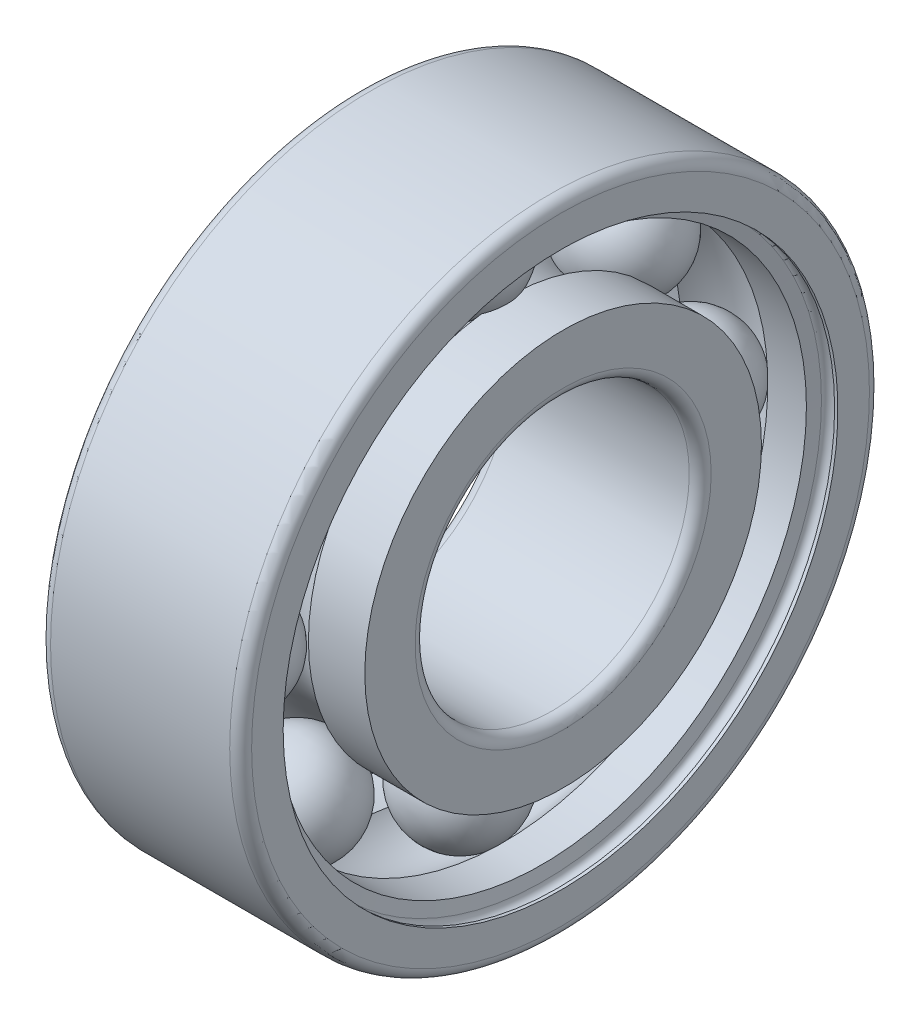
ISO-10303-21;
HEADER;
FILE_DESCRIPTION(('STEP AP214'),'2;1');
FILE_NAME('part.step','',(''),(''),'','','');
FILE_SCHEMA(('AUTOMOTIVE_DESIGN { 1 0 10303 214 1 1 1 1 }'));
ENDSEC;
DATA;
#1=APPLICATION_CONTEXT('core data for automotive mechanical design processes');
#2=APPLICATION_PROTOCOL_DEFINITION('international standard','automotive_design',2000,#1);
#3=PRODUCT_CONTEXT('',#1,'mechanical');
#4=PRODUCT('Part','Part','',(#3));
#5=PRODUCT_RELATED_PRODUCT_CATEGORY('part','',(#4));
#6=PRODUCT_DEFINITION_FORMATION('','',#4);
#7=PRODUCT_DEFINITION_CONTEXT('part definition',#1,'design');
#8=PRODUCT_DEFINITION('design','',#6,#7);
#9=PRODUCT_DEFINITION_SHAPE('','',#8);
#10=(LENGTH_UNIT() NAMED_UNIT(*) SI_UNIT(.MILLI.,.METRE.));
#11=(NAMED_UNIT(*) PLANE_ANGLE_UNIT() SI_UNIT($,.RADIAN.));
#12=(NAMED_UNIT(*) SI_UNIT($,.STERADIAN.) SOLID_ANGLE_UNIT());
#13=UNCERTAINTY_MEASURE_WITH_UNIT(LENGTH_MEASURE(1.E-05),#10,'distance_accuracy_value','');
#14=(GEOMETRIC_REPRESENTATION_CONTEXT(3) GLOBAL_UNCERTAINTY_ASSIGNED_CONTEXT((#13)) GLOBAL_UNIT_ASSIGNED_CONTEXT((#10,
#11,#12)) REPRESENTATION_CONTEXT('',''));
#15=CARTESIAN_POINT('',(0.,0.,0.));
#16=DIRECTION('',(0.,0.,1.));
#17=DIRECTION('',(1.,0.,0.));
#18=AXIS2_PLACEMENT_3D('',#15,#16,#17);
#19=CARTESIAN_POINT('',(5.5,0.,12.63));
#20=DIRECTION('',(0.,0.,-1.));
#21=DIRECTION('',(0.,1.,0.));
#22=AXIS2_PLACEMENT_3D('',#19,#20,#21);
#23=SPHERICAL_SURFACE('',#22,3.);
#24=CARTESIAN_POINT('',(5.5,0.,15.63));
#25=VERTEX_POINT('',#24);
#26=VERTEX_LOOP('',#25);
#27=FACE_BOUND('',#26,.T.);
#28=CARTESIAN_POINT('',(5.5,0.,9.63));
#29=VERTEX_POINT('',#28);
#30=VERTEX_LOOP('',#29);
#31=FACE_BOUND('',#30,.T.);
#32=ADVANCED_FACE('P0_F16',(#27,#31),#23,.T.);
#33=CLOSED_SHELL('',(#32));
#34=MANIFOLD_SOLID_BREP('P0_B1',#33);
#35=CARTESIAN_POINT('',(5.5,-8.93075864638609,-8.9307586463861));
#36=DIRECTION('',(0.,0.707106781186547,0.707106781186548));
#37=DIRECTION('',(0.,-0.707106781186548,0.707106781186547));
#38=AXIS2_PLACEMENT_3D('',#35,#36,#37);
#39=SPHERICAL_SURFACE('',#38,3.);
#40=CARTESIAN_POINT('',(5.5,-11.0520789899457,-11.0520789899457));
#41=VERTEX_POINT('',#40);
#42=VERTEX_LOOP('',#41);
#43=FACE_BOUND('',#42,.T.);
#44=CARTESIAN_POINT('',(5.5,-6.80943830282645,-6.80943830282646));
#45=VERTEX_POINT('',#44);
#46=VERTEX_LOOP('',#45);
#47=FACE_BOUND('',#46,.T.);
#48=ADVANCED_FACE('P1_F16',(#43,#47),#39,.T.);
#49=CLOSED_SHELL('',(#48));
#50=MANIFOLD_SOLID_BREP('P1_B1',#49);
#51=CARTESIAN_POINT('',(5.5,8.93075864638609,8.9307586463861));
#52=DIRECTION('',(0.,-0.707106781186547,-0.707106781186548));
#53=DIRECTION('',(0.,0.707106781186548,-0.707106781186547));
#54=AXIS2_PLACEMENT_3D('',#51,#52,#53);
#55=SPHERICAL_SURFACE('',#54,3.);
#56=CARTESIAN_POINT('',(5.5,11.0520789899457,11.0520789899457));
#57=VERTEX_POINT('',#56);
#58=VERTEX_LOOP('',#57);
#59=FACE_BOUND('',#58,.T.);
#60=CARTESIAN_POINT('',(5.5,6.80943830282645,6.80943830282646));
#61=VERTEX_POINT('',#60);
#62=VERTEX_LOOP('',#61);
#63=FACE_BOUND('',#62,.T.);
#64=ADVANCED_FACE('P2_F15',(#59,#63),#55,.T.);
#65=CLOSED_SHELL('',(#64));
#66=MANIFOLD_SOLID_BREP('P2_B1',#65);
#67=CARTESIAN_POINT('',(5.5,-8.9307586463861,8.93075864638609));
#68=DIRECTION('',(0.,0.707106781186548,-0.707106781186547));
#69=DIRECTION('',(0.,0.707106781186547,0.707106781186548));
#70=AXIS2_PLACEMENT_3D('',#67,#68,#69);
#71=SPHERICAL_SURFACE('',#70,3.);
#72=CARTESIAN_POINT('',(5.5,-11.0520789899457,11.0520789899457));
#73=VERTEX_POINT('',#72);
#74=VERTEX_LOOP('',#73);
#75=FACE_BOUND('',#74,.T.);
#76=CARTESIAN_POINT('',(5.5,-6.80943830282646,6.80943830282645));
#77=VERTEX_POINT('',#76);
#78=VERTEX_LOOP('',#77);
#79=FACE_BOUND('',#78,.T.);
#80=ADVANCED_FACE('P3_F16',(#75,#79),#71,.T.);
#81=CLOSED_SHELL('',(#80));
#82=MANIFOLD_SOLID_BREP('P3_B1',#81);
#83=CARTESIAN_POINT('',(5.5,8.9307586463861,-8.93075864638609));
#84=DIRECTION('',(0.,-0.707106781186548,0.707106781186547));
#85=DIRECTION('',(0.,-0.707106781186547,-0.707106781186548));
#86=AXIS2_PLACEMENT_3D('',#83,#84,#85);
#87=SPHERICAL_SURFACE('',#86,3.);
#88=CARTESIAN_POINT('',(5.5,11.0520789899457,-11.0520789899457));
#89=VERTEX_POINT('',#88);
#90=VERTEX_LOOP('',#89);
#91=FACE_BOUND('',#90,.T.);
#92=CARTESIAN_POINT('',(5.5,6.80943830282646,-6.80943830282645));
#93=VERTEX_POINT('',#92);
#94=VERTEX_LOOP('',#93);
#95=FACE_BOUND('',#94,.T.);
#96=ADVANCED_FACE('P4_F16',(#91,#95),#87,.T.);
#97=CLOSED_SHELL('',(#96));
#98=MANIFOLD_SOLID_BREP('P4_B1',#97);
#99=CARTESIAN_POINT('',(5.5,0.,-12.63));
#100=DIRECTION('',(0.,0.,1.));
#101=DIRECTION('',(0.,-1.,0.));
#102=AXIS2_PLACEMENT_3D('',#99,#100,#101);
#103=SPHERICAL_SURFACE('',#102,3.);
#104=CARTESIAN_POINT('',(5.5,0.,-15.63));
#105=VERTEX_POINT('',#104);
#106=VERTEX_LOOP('',#105);
#107=FACE_BOUND('',#106,.T.);
#108=CARTESIAN_POINT('',(5.5,0.,-9.63));
#109=VERTEX_POINT('',#108);
#110=VERTEX_LOOP('',#109);
#111=FACE_BOUND('',#110,.T.);
#112=ADVANCED_FACE('P5_F16',(#107,#111),#103,.T.);
#113=CLOSED_SHELL('',(#112));
#114=MANIFOLD_SOLID_BREP('P5_B1',#113);
#115=CARTESIAN_POINT('',(5.5,-12.63,0.));
#116=DIRECTION('',(0.,1.,0.));
#117=DIRECTION('',(0.,0.,1.));
#118=AXIS2_PLACEMENT_3D('',#115,#116,#117);
#119=SPHERICAL_SURFACE('',#118,3.);
#120=CARTESIAN_POINT('',(5.5,-15.63,0.));
#121=VERTEX_POINT('',#120);
#122=VERTEX_LOOP('',#121);
#123=FACE_BOUND('',#122,.T.);
#124=CARTESIAN_POINT('',(5.5,-9.63,0.));
#125=VERTEX_POINT('',#124);
#126=VERTEX_LOOP('',#125);
#127=FACE_BOUND('',#126,.T.);
#128=ADVANCED_FACE('P6_F16',(#123,#127),#119,.T.);
#129=CLOSED_SHELL('',(#128));
#130=MANIFOLD_SOLID_BREP('P6_B1',#129);
#131=CARTESIAN_POINT('',(5.5,12.63,0.));
#132=DIRECTION('',(0.,-1.,0.));
#133=DIRECTION('',(0.,0.,-1.));
#134=AXIS2_PLACEMENT_3D('',#131,#132,#133);
#135=SPHERICAL_SURFACE('',#134,3.);
#136=CARTESIAN_POINT('',(5.5,15.63,0.));
#137=VERTEX_POINT('',#136);
#138=VERTEX_LOOP('',#137);
#139=FACE_BOUND('',#138,.T.);
#140=CARTESIAN_POINT('',(5.5,9.63,0.));
#141=VERTEX_POINT('',#140);
#142=VERTEX_LOOP('',#141);
#143=FACE_BOUND('',#142,.T.);
#144=ADVANCED_FACE('P7_F16',(#139,#143),#135,.T.);
#145=CLOSED_SHELL('',(#144));
#146=MANIFOLD_SOLID_BREP('P7_B1',#145);
#147=CARTESIAN_POINT('',(5.5,0.,0.));
#148=DIRECTION('',(1.,0.,0.));
#149=DIRECTION('',(0.,0.,-1.));
#150=AXIS2_PLACEMENT_3D('',#147,#148,#149);
#151=TOROIDAL_SURFACE('',#150,12.63,3.);
#152=CARTESIAN_POINT('',(7.86558132390328,0.,0.));
#153=DIRECTION('',(-1.,0.,0.));
#154=DIRECTION('',(0.,0.,1.));
#155=AXIS2_PLACEMENT_3D('',#152,#153,#154);
#156=CIRCLE('',#155,14.475);
#157=CARTESIAN_POINT('',(7.86558132390328,0.,14.475));
#158=VERTEX_POINT('',#157);
#159=EDGE_CURVE('P8_E124',#158,#158,#156,.F.);
#160=ORIENTED_EDGE('',*,*,#159,.T.);
#161=EDGE_LOOP('',(#160));
#162=FACE_BOUND('',#161,.T.);
#163=CARTESIAN_POINT('',(3.13441867609672,0.,0.));
#164=DIRECTION('',(-1.,0.,0.));
#165=DIRECTION('',(0.,0.,1.));
#166=AXIS2_PLACEMENT_3D('',#163,#164,#165);
#167=CIRCLE('',#166,14.475);
#168=CARTESIAN_POINT('',(3.13441867609672,0.,14.475));
#169=VERTEX_POINT('',#168);
#170=EDGE_CURVE('P8_E129',#169,#169,#167,.T.);
#171=ORIENTED_EDGE('',*,*,#170,.T.);
#172=EDGE_LOOP('',(#171));
#173=FACE_BOUND('',#172,.T.);
#174=ADVANCED_FACE('P8_F15',(#162,#173),#151,.F.);
#175=CARTESIAN_POINT('',(50.,0.,0.));
#176=DIRECTION('',(-1.,0.,0.));
#177=DIRECTION('',(0.,0.,1.));
#178=AXIS2_PLACEMENT_3D('',#175,#176,#177);
#179=CYLINDRICAL_SURFACE('',#178,14.475);
#180=CARTESIAN_POINT('',(1.02342888649593,0.,0.));
#181=DIRECTION('',(-1.,0.,0.));
#182=DIRECTION('',(0.,0.,1.));
#183=AXIS2_PLACEMENT_3D('',#180,#181,#182);
#184=CIRCLE('',#183,14.475);
#185=CARTESIAN_POINT('',(1.02342888649593,0.,14.475));
#186=VERTEX_POINT('',#185);
#187=EDGE_CURVE('P8_E119',#186,#186,#184,.T.);
#188=ORIENTED_EDGE('',*,*,#187,.T.);
#189=EDGE_LOOP('',(#188));
#190=FACE_BOUND('',#189,.T.);
#191=ORIENTED_EDGE('',*,*,#170,.F.);
#192=EDGE_LOOP('',(#191));
#193=FACE_BOUND('',#192,.T.);
#194=ADVANCED_FACE('P8_F266',(#190,#193),#179,.F.);
#195=CARTESIAN_POINT('',(50.,0.,0.));
#196=DIRECTION('',(-1.,0.,0.));
#197=DIRECTION('',(0.,0.,1.));
#198=AXIS2_PLACEMENT_3D('',#195,#196,#197);
#199=CYLINDRICAL_SURFACE('',#198,14.475);
#200=ORIENTED_EDGE('',*,*,#159,.F.);
#201=EDGE_LOOP('',(#200));
#202=FACE_BOUND('',#201,.T.);
#203=CARTESIAN_POINT('',(9.97657111350408,0.,0.));
#204=DIRECTION('',(1.,0.,0.));
#205=DIRECTION('',(0.,0.,-1.));
#206=AXIS2_PLACEMENT_3D('',#203,#204,#205);
#207=CIRCLE('',#206,14.475);
#208=CARTESIAN_POINT('',(9.97657111350408,0.,-14.475));
#209=VERTEX_POINT('',#208);
#210=EDGE_CURVE('P8_E114',#209,#209,#207,.T.);
#211=ORIENTED_EDGE('',*,*,#210,.T.);
#212=EDGE_LOOP('',(#211));
#213=FACE_BOUND('',#212,.T.);
#214=ADVANCED_FACE('P8_F258',(#202,#213),#199,.F.);
#215=CARTESIAN_POINT('',(0.899999999999998,0.,0.));
#216=DIRECTION('',(-1.,0.,0.));
#217=DIRECTION('',(0.,0.,1.));
#218=AXIS2_PLACEMENT_3D('',#215,#216,#217);
#219=CONICAL_SURFACE('',#218,15.175,1.39626340159546);
#220=CARTESIAN_POINT('',(0.9,0.,0.));
#221=DIRECTION('',(1.,0.,0.));
#222=DIRECTION('',(0.,0.,-1.));
#223=AXIS2_PLACEMENT_3D('',#220,#221,#222);
#224=CIRCLE('',#223,15.175);
#225=CARTESIAN_POINT('',(0.9,0.,-15.175));
#226=VERTEX_POINT('',#225);
#227=EDGE_CURVE('P8_E108',#226,#226,#224,.F.);
#228=ORIENTED_EDGE('',*,*,#227,.T.);
#229=EDGE_LOOP('',(#228));
#230=FACE_BOUND('',#229,.T.);
#231=ORIENTED_EDGE('',*,*,#187,.F.);
#232=EDGE_LOOP('',(#231));
#233=FACE_BOUND('',#232,.T.);
#234=ADVANCED_FACE('P8_F168',(#230,#233),#219,.F.);
#235=CARTESIAN_POINT('',(10.1,0.,0.));
#236=DIRECTION('',(1.,0.,0.));
#237=DIRECTION('',(0.,0.,-1.));
#238=AXIS2_PLACEMENT_3D('',#235,#236,#237);
#239=CONICAL_SURFACE('',#238,15.175,1.39626340159547);
#240=ORIENTED_EDGE('',*,*,#210,.F.);
#241=EDGE_LOOP('',(#240));
#242=FACE_BOUND('',#241,.T.);
#243=CARTESIAN_POINT('',(10.1,0.,0.));
#244=DIRECTION('',(1.,0.,0.));
#245=DIRECTION('',(0.,0.,-1.));
#246=AXIS2_PLACEMENT_3D('',#243,#244,#245);
#247=CIRCLE('',#246,15.175);
#248=CARTESIAN_POINT('',(10.1,0.,-15.175));
#249=VERTEX_POINT('',#248);
#250=EDGE_CURVE('P8_E104',#249,#249,#247,.T.);
#251=ORIENTED_EDGE('',*,*,#250,.T.);
#252=EDGE_LOOP('',(#251));
#253=FACE_BOUND('',#252,.T.);
#254=ADVANCED_FACE('P8_F161',(#242,#253),#239,.F.);
#255=CARTESIAN_POINT('',(0.54,0.,0.));
#256=DIRECTION('',(1.,0.,0.));
#257=DIRECTION('',(0.,0.,-1.));
#258=AXIS2_PLACEMENT_3D('',#255,#256,#257);
#259=TOROIDAL_SURFACE('',#258,15.175,0.36);
#260=ORIENTED_EDGE('',*,*,#227,.F.);
#261=EDGE_LOOP('',(#260));
#262=FACE_BOUND('',#261,.T.);
#263=CARTESIAN_POINT('',(0.18,0.,0.));
#264=DIRECTION('',(-1.,0.,0.));
#265=DIRECTION('',(0.,0.,1.));
#266=AXIS2_PLACEMENT_3D('',#263,#264,#265);
#267=CIRCLE('',#266,15.175);
#268=CARTESIAN_POINT('',(0.18,0.,15.175));
#269=VERTEX_POINT('',#268);
#270=EDGE_CURVE('P8_E107',#269,#269,#267,.T.);
#271=ORIENTED_EDGE('',*,*,#270,.T.);
#272=EDGE_LOOP('',(#271));
#273=FACE_BOUND('',#272,.T.);
#274=ADVANCED_FACE('P8_F95',(#262,#273),#259,.F.);
#275=CARTESIAN_POINT('',(10.46,0.,0.));
#276=DIRECTION('',(1.,0.,0.));
#277=DIRECTION('',(0.,0.,-1.));
#278=AXIS2_PLACEMENT_3D('',#275,#276,#277);
#279=TOROIDAL_SURFACE('',#278,15.1750000189953,0.36);
#280=CARTESIAN_POINT('',(10.8199999999995,0.,0.));
#281=DIRECTION('',(-1.,0.,0.));
#282=DIRECTION('',(0.,0.,1.));
#283=AXIS2_PLACEMENT_3D('',#280,#281,#282);
#284=CIRCLE('',#283,15.175000313621);
#285=CARTESIAN_POINT('',(10.8199999999995,0.,15.175000313621));
#286=VERTEX_POINT('',#285);
#287=EDGE_CURVE('P8_E141',#286,#286,#284,.F.);
#288=ORIENTED_EDGE('',*,*,#287,.T.);
#289=EDGE_LOOP('',(#288));
#290=FACE_BOUND('',#289,.T.);
#291=ORIENTED_EDGE('',*,*,#250,.F.);
#292=EDGE_LOOP('',(#291));
#293=FACE_BOUND('',#292,.T.);
#294=ADVANCED_FACE('P8_F90',(#290,#293),#279,.F.);
#295=CARTESIAN_POINT('',(50.,0.,0.));
#296=DIRECTION('',(-1.,0.,0.));
#297=DIRECTION('',(0.,0.,1.));
#298=AXIS2_PLACEMENT_3D('',#295,#296,#297);
#299=CYLINDRICAL_SURFACE('',#298,15.175);
#300=CARTESIAN_POINT('',(0.,0.,0.));
#301=DIRECTION('',(-1.,0.,0.));
#302=DIRECTION('',(0.,0.,1.));
#303=AXIS2_PLACEMENT_3D('',#300,#301,#302);
#304=CIRCLE('',#303,15.175);
#305=CARTESIAN_POINT('',(0.,0.,15.175));
#306=VERTEX_POINT('',#305);
#307=EDGE_CURVE('P8_E19',#306,#306,#304,.F.);
#308=ORIENTED_EDGE('',*,*,#307,.F.);
#309=EDGE_LOOP('',(#308));
#310=FACE_BOUND('',#309,.T.);
#311=ORIENTED_EDGE('',*,*,#270,.F.);
#312=EDGE_LOOP('',(#311));
#313=FACE_BOUND('',#312,.T.);
#314=ADVANCED_FACE('P8_F86',(#310,#313),#299,.F.);
#315=CARTESIAN_POINT('',(50.,0.,0.));
#316=DIRECTION('',(-1.,0.,0.));
#317=DIRECTION('',(0.,0.,1.));
#318=AXIS2_PLACEMENT_3D('',#315,#316,#317);
#319=CYLINDRICAL_SURFACE('',#318,15.175000313621);
#320=ORIENTED_EDGE('',*,*,#287,.F.);
#321=EDGE_LOOP('',(#320));
#322=FACE_BOUND('',#321,.T.);
#323=CARTESIAN_POINT('',(11.,0.,0.));
#324=DIRECTION('',(-1.,0.,0.));
#325=DIRECTION('',(0.,0.,1.));
#326=AXIS2_PLACEMENT_3D('',#323,#324,#325);
#327=CIRCLE('',#326,15.175000313621);
#328=CARTESIAN_POINT('',(11.,0.,15.175000313621));
#329=VERTEX_POINT('',#328);
#330=EDGE_CURVE('P8_E136',#329,#329,#327,.T.);
#331=ORIENTED_EDGE('',*,*,#330,.F.);
#332=EDGE_LOOP('',(#331));
#333=FACE_BOUND('',#332,.T.);
#334=ADVANCED_FACE('P8_F82',(#322,#333),#319,.F.);
#335=CARTESIAN_POINT('',(0.,16.9,0.));
#336=DIRECTION('',(-1.,0.,0.));
#337=DIRECTION('',(0.,0.,1.));
#338=AXIS2_PLACEMENT_3D('',#335,#336,#337);
#339=PLANE('',#338);
#340=CARTESIAN_POINT('',(0.,0.,0.));
#341=DIRECTION('',(1.,0.,0.));
#342=DIRECTION('',(0.,0.,-1.));
#343=AXIS2_PLACEMENT_3D('',#340,#341,#342);
#344=CIRCLE('',#343,16.9);
#345=CARTESIAN_POINT('',(0.,0.,-16.9));
#346=VERTEX_POINT('',#345);
#347=EDGE_CURVE('P8_E66',#346,#346,#344,.T.);
#348=ORIENTED_EDGE('',*,*,#347,.F.);
#349=EDGE_LOOP('',(#348));
#350=FACE_BOUND('',#349,.T.);
#351=ORIENTED_EDGE('',*,*,#307,.T.);
#352=EDGE_LOOP('',(#351));
#353=FACE_BOUND('',#352,.T.);
#354=ADVANCED_FACE('P8_F72',(#350,#353),#339,.T.);
#355=CARTESIAN_POINT('',(11.,15.175,0.));
#356=DIRECTION('',(1.,0.,0.));
#357=DIRECTION('',(0.,0.,-1.));
#358=AXIS2_PLACEMENT_3D('',#355,#356,#357);
#359=PLANE('',#358);
#360=ORIENTED_EDGE('',*,*,#330,.T.);
#361=EDGE_LOOP('',(#360));
#362=FACE_BOUND('',#361,.T.);
#363=CARTESIAN_POINT('',(11.,0.,0.));
#364=DIRECTION('',(-1.,0.,0.));
#365=DIRECTION('',(0.,0.,-1.));
#366=AXIS2_PLACEMENT_3D('',#363,#364,#365);
#367=CIRCLE('',#366,16.9);
#368=CARTESIAN_POINT('',(11.,0.,-16.9));
#369=VERTEX_POINT('',#368);
#370=EDGE_CURVE('P8_E28',#369,#369,#367,.T.);
#371=ORIENTED_EDGE('',*,*,#370,.F.);
#372=EDGE_LOOP('',(#371));
#373=FACE_BOUND('',#372,.T.);
#374=ADVANCED_FACE('P8_F81',(#362,#373),#359,.T.);
#375=CARTESIAN_POINT('',(0.600000000000004,0.,0.));
#376=DIRECTION('',(1.,0.,0.));
#377=DIRECTION('',(0.,0.,-1.));
#378=AXIS2_PLACEMENT_3D('',#375,#376,#377);
#379=TOROIDAL_SURFACE('',#378,16.9,0.600000000000003);
#380=CARTESIAN_POINT('',(0.600000000000003,0.,0.));
#381=DIRECTION('',(-1.,0.,0.));
#382=DIRECTION('',(0.,0.,1.));
#383=AXIS2_PLACEMENT_3D('',#380,#381,#382);
#384=CIRCLE('',#383,17.5);
#385=CARTESIAN_POINT('',(0.600000000000003,0.,17.5));
#386=VERTEX_POINT('',#385);
#387=EDGE_CURVE('P8_E23',#386,#386,#384,.F.);
#388=ORIENTED_EDGE('',*,*,#387,.F.);
#389=EDGE_LOOP('',(#388));
#390=FACE_BOUND('',#389,.T.);
#391=ORIENTED_EDGE('',*,*,#347,.T.);
#392=EDGE_LOOP('',(#391));
#393=FACE_BOUND('',#392,.T.);
#394=ADVANCED_FACE('P8_F46',(#390,#393),#379,.T.);
#395=CARTESIAN_POINT('',(10.4,0.,0.));
#396=DIRECTION('',(1.,0.,0.));
#397=DIRECTION('',(0.,0.,-1.));
#398=AXIS2_PLACEMENT_3D('',#395,#396,#397);
#399=TOROIDAL_SURFACE('',#398,16.9,0.600000000000003);
#400=ORIENTED_EDGE('',*,*,#370,.T.);
#401=EDGE_LOOP('',(#400));
#402=FACE_BOUND('',#401,.T.);
#403=CARTESIAN_POINT('',(10.4,0.,0.));
#404=DIRECTION('',(-1.,0.,0.));
#405=DIRECTION('',(0.,0.,1.));
#406=AXIS2_PLACEMENT_3D('',#403,#404,#405);
#407=CIRCLE('',#406,17.5);
#408=CARTESIAN_POINT('',(10.4,0.,17.5));
#409=VERTEX_POINT('',#408);
#410=EDGE_CURVE('P8_E10',#409,#409,#407,.T.);
#411=ORIENTED_EDGE('',*,*,#410,.F.);
#412=EDGE_LOOP('',(#411));
#413=FACE_BOUND('',#412,.T.);
#414=ADVANCED_FACE('P8_F40',(#402,#413),#399,.T.);
#415=CARTESIAN_POINT('',(50.,0.,0.));
#416=DIRECTION('',(-1.,0.,0.));
#417=DIRECTION('',(0.,0.,1.));
#418=AXIS2_PLACEMENT_3D('',#415,#416,#417);
#419=CYLINDRICAL_SURFACE('',#418,17.5);
#420=ORIENTED_EDGE('',*,*,#410,.T.);
#421=EDGE_LOOP('',(#420));
#422=FACE_BOUND('',#421,.T.);
#423=ORIENTED_EDGE('',*,*,#387,.T.);
#424=EDGE_LOOP('',(#423));
#425=FACE_BOUND('',#424,.T.);
#426=ADVANCED_FACE('P8_F45',(#422,#425),#419,.T.);
#427=CLOSED_SHELL('',(#174,#194,#214,#234,#254,#274,#294,#314,#334,#354,#374,#394,#414,#426));
#428=MANIFOLD_SOLID_BREP('P8_B1',#427);
#429=CARTESIAN_POINT('',(5.39629510859992,0.347120126547476,-0.245515562798221));
#430=DIRECTION('',(1.,0.,0.));
#431=DIRECTION('',(0.,0.,-1.));
#432=AXIS2_PLACEMENT_3D('',#429,#430,#431);
#433=TOROIDAL_SURFACE('',#432,12.63,3.);
#434=CARTESIAN_POINT('',(2.98142451165276,0.347120126547476,-0.245515562798221));
#435=DIRECTION('',(-1.,0.,0.));
#436=DIRECTION('',(0.,0.,1.));
#437=AXIS2_PLACEMENT_3D('',#434,#435,#436);
#438=CIRCLE('',#437,10.85);
#439=CARTESIAN_POINT('',(2.98142451165276,0.347120126547476,10.6044844372018));
#440=VERTEX_POINT('',#439);
#441=EDGE_CURVE('P9_E110',#440,#440,#438,.T.);
#442=ORIENTED_EDGE('',*,*,#441,.F.);
#443=EDGE_LOOP('',(#442));
#444=FACE_BOUND('',#443,.T.);
#445=CARTESIAN_POINT('',(7.8111657055471,0.347120126547476,-0.245515562798221));
#446=DIRECTION('',(-1.,0.,0.));
#447=DIRECTION('',(0.,0.,1.));
#448=AXIS2_PLACEMENT_3D('',#445,#446,#447);
#449=CIRCLE('',#448,10.85);
#450=CARTESIAN_POINT('',(7.8111657055471,0.347120126547476,10.6044844372018));
#451=VERTEX_POINT('',#450);
#452=EDGE_CURVE('P9_E115',#451,#451,#449,.F.);
#453=ORIENTED_EDGE('',*,*,#452,.F.);
#454=EDGE_LOOP('',(#453));
#455=FACE_BOUND('',#454,.T.);
#456=ADVANCED_FACE('P9_F15',(#444,#455),#433,.F.);
#457=CARTESIAN_POINT('',(49.8962951085999,0.347120126547476,-0.245515562798221));
#458=DIRECTION('',(-1.,0.,0.));
#459=DIRECTION('',(0.,0.,1.));
#460=AXIS2_PLACEMENT_3D('',#457,#458,#459);
#461=CYLINDRICAL_SURFACE('',#460,10.85);
#462=CARTESIAN_POINT('',(10.8962951085999,0.347120126547476,-0.245515562798221));
#463=DIRECTION('',(-1.,0.,0.));
#464=DIRECTION('',(0.,0.,1.));
#465=AXIS2_PLACEMENT_3D('',#462,#463,#464);
#466=CIRCLE('',#465,10.85);
#467=CARTESIAN_POINT('',(10.8962951085999,0.347120126547476,10.6044844372018));
#468=VERTEX_POINT('',#467);
#469=EDGE_CURVE('P9_E19',#468,#468,#466,.F.);
#470=ORIENTED_EDGE('',*,*,#469,.F.);
#471=EDGE_LOOP('',(#470));
#472=FACE_BOUND('',#471,.T.);
#473=ORIENTED_EDGE('',*,*,#452,.T.);
#474=EDGE_LOOP('',(#473));
#475=FACE_BOUND('',#474,.T.);
#476=ADVANCED_FACE('P9_F85',(#472,#475),#461,.T.);
#477=CARTESIAN_POINT('',(49.8962951085999,0.347120126547476,-0.245515562798221));
#478=DIRECTION('',(-1.,0.,0.));
#479=DIRECTION('',(0.,0.,1.));
#480=AXIS2_PLACEMENT_3D('',#477,#478,#479);
#481=CYLINDRICAL_SURFACE('',#480,10.85);
#482=ORIENTED_EDGE('',*,*,#441,.T.);
#483=EDGE_LOOP('',(#482));
#484=FACE_BOUND('',#483,.T.);
#485=CARTESIAN_POINT('',(-0.103704891400077,0.347120126547476,-0.245515562798221));
#486=DIRECTION('',(-1.,0.,0.));
#487=DIRECTION('',(0.,0.,1.));
#488=AXIS2_PLACEMENT_3D('',#485,#486,#487);
#489=CIRCLE('',#488,10.85);
#490=CARTESIAN_POINT('',(-0.103704891400077,0.347120126547476,10.6044844372018));
#491=VERTEX_POINT('',#490);
#492=EDGE_CURVE('P9_E105',#491,#491,#489,.T.);
#493=ORIENTED_EDGE('',*,*,#492,.F.);
#494=EDGE_LOOP('',(#493));
#495=FACE_BOUND('',#494,.T.);
#496=ADVANCED_FACE('P9_F82',(#484,#495),#481,.T.);
#497=CARTESIAN_POINT('',(10.8962951085999,8.44712012654748,-0.245515562798221));
#498=DIRECTION('',(1.,0.,0.));
#499=DIRECTION('',(0.,0.,-1.));
#500=AXIS2_PLACEMENT_3D('',#497,#498,#499);
#501=PLANE('',#500);
#502=CARTESIAN_POINT('',(10.8962951085999,0.347120126547476,-0.245515562798221));
#503=DIRECTION('',(1.,0.,0.));
#504=DIRECTION('',(0.,0.,-1.));
#505=AXIS2_PLACEMENT_3D('',#502,#503,#504);
#506=CIRCLE('',#505,8.1);
#507=CARTESIAN_POINT('',(10.8962951085999,0.347120126547474,-8.34551556279822));
#508=VERTEX_POINT('',#507);
#509=EDGE_CURVE('P9_E66',#508,#508,#506,.T.);
#510=ORIENTED_EDGE('',*,*,#509,.F.);
#511=EDGE_LOOP('',(#510));
#512=FACE_BOUND('',#511,.T.);
#513=ORIENTED_EDGE('',*,*,#469,.T.);
#514=EDGE_LOOP('',(#513));
#515=FACE_BOUND('',#514,.T.);
#516=ADVANCED_FACE('P9_F72',(#512,#515),#501,.T.);
#517=CARTESIAN_POINT('',(-0.103704891400077,11.1971201265475,-0.245515562798221));
#518=DIRECTION('',(-1.,0.,0.));
#519=DIRECTION('',(0.,0.,1.));
#520=AXIS2_PLACEMENT_3D('',#517,#518,#519);
#521=PLANE('',#520);
#522=ORIENTED_EDGE('',*,*,#492,.T.);
#523=EDGE_LOOP('',(#522));
#524=FACE_BOUND('',#523,.T.);
#525=CARTESIAN_POINT('',(-0.103704891400077,0.347120126547476,-0.245515562798221));
#526=DIRECTION('',(-1.,0.,0.));
#527=DIRECTION('',(0.,0.,-1.));
#528=AXIS2_PLACEMENT_3D('',#525,#526,#527);
#529=CIRCLE('',#528,8.1);
#530=CARTESIAN_POINT('',(-0.103704891400077,0.347120126547476,-8.34551556279822));
#531=VERTEX_POINT('',#530);
#532=EDGE_CURVE('P9_E28',#531,#531,#529,.T.);
#533=ORIENTED_EDGE('',*,*,#532,.F.);
#534=EDGE_LOOP('',(#533));
#535=FACE_BOUND('',#534,.T.);
#536=ADVANCED_FACE('P9_F81',(#524,#535),#521,.T.);
#537=CARTESIAN_POINT('',(10.2962951085999,0.347120126547476,-0.245515562798221));
#538=DIRECTION('',(1.,0.,0.));
#539=DIRECTION('',(0.,0.,-1.));
#540=AXIS2_PLACEMENT_3D('',#537,#538,#539);
#541=TOROIDAL_SURFACE('',#540,8.1,0.600000000000002);
#542=CARTESIAN_POINT('',(10.2962951085999,0.347120126547476,-0.245515562798221));
#543=DIRECTION('',(-1.,0.,0.));
#544=DIRECTION('',(0.,0.,1.));
#545=AXIS2_PLACEMENT_3D('',#542,#543,#544);
#546=CIRCLE('',#545,7.5);
#547=CARTESIAN_POINT('',(10.2962951085999,0.347120126547476,7.25448443720178));
#548=VERTEX_POINT('',#547);
#549=EDGE_CURVE('P9_E23',#548,#548,#546,.T.);
#550=ORIENTED_EDGE('',*,*,#549,.T.);
#551=EDGE_LOOP('',(#550));
#552=FACE_BOUND('',#551,.T.);
#553=ORIENTED_EDGE('',*,*,#509,.T.);
#554=EDGE_LOOP('',(#553));
#555=FACE_BOUND('',#554,.T.);
#556=ADVANCED_FACE('P9_F46',(#552,#555),#541,.T.);
#557=CARTESIAN_POINT('',(0.496295108599924,0.347120126547476,-0.245515562798221));
#558=DIRECTION('',(1.,0.,0.));
#559=DIRECTION('',(0.,0.,-1.));
#560=AXIS2_PLACEMENT_3D('',#557,#558,#559);
#561=TOROIDAL_SURFACE('',#560,8.1,0.600000000000001);
#562=ORIENTED_EDGE('',*,*,#532,.T.);
#563=EDGE_LOOP('',(#562));
#564=FACE_BOUND('',#563,.T.);
#565=CARTESIAN_POINT('',(0.496295108599926,0.347120126547476,-0.245515562798221));
#566=DIRECTION('',(-1.,0.,0.));
#567=DIRECTION('',(0.,0.,1.));
#568=AXIS2_PLACEMENT_3D('',#565,#566,#567);
#569=CIRCLE('',#568,7.5);
#570=CARTESIAN_POINT('',(0.496295108599926,0.347120126547476,7.25448443720178));
#571=VERTEX_POINT('',#570);
#572=EDGE_CURVE('P9_E10',#571,#571,#569,.F.);
#573=ORIENTED_EDGE('',*,*,#572,.T.);
#574=EDGE_LOOP('',(#573));
#575=FACE_BOUND('',#574,.T.);
#576=ADVANCED_FACE('P9_F40',(#564,#575),#561,.T.);
#577=CARTESIAN_POINT('',(49.8962951085999,0.347120126547476,-0.245515562798221));
#578=DIRECTION('',(-1.,0.,0.));
#579=DIRECTION('',(0.,0.,1.));
#580=AXIS2_PLACEMENT_3D('',#577,#578,#579);
#581=CYLINDRICAL_SURFACE('',#580,7.5);
#582=ORIENTED_EDGE('',*,*,#572,.F.);
#583=EDGE_LOOP('',(#582));
#584=FACE_BOUND('',#583,.T.);
#585=ORIENTED_EDGE('',*,*,#549,.F.);
#586=EDGE_LOOP('',(#585));
#587=FACE_BOUND('',#586,.T.);
#588=ADVANCED_FACE('P9_F45',(#584,#587),#581,.F.);
#589=CLOSED_SHELL('',(#456,#476,#496,#516,#536,#556,#576,#588));
#590=MANIFOLD_SOLID_BREP('P9_B1',#589);
#591=ADVANCED_BREP_SHAPE_REPRESENTATION('',(#18,#34,#50,#66,#82,#98,#114,#130,#146,#428,#590),#14);
#592=SHAPE_DEFINITION_REPRESENTATION(#9,#591);
ENDSEC;
END-ISO-10303-21;
